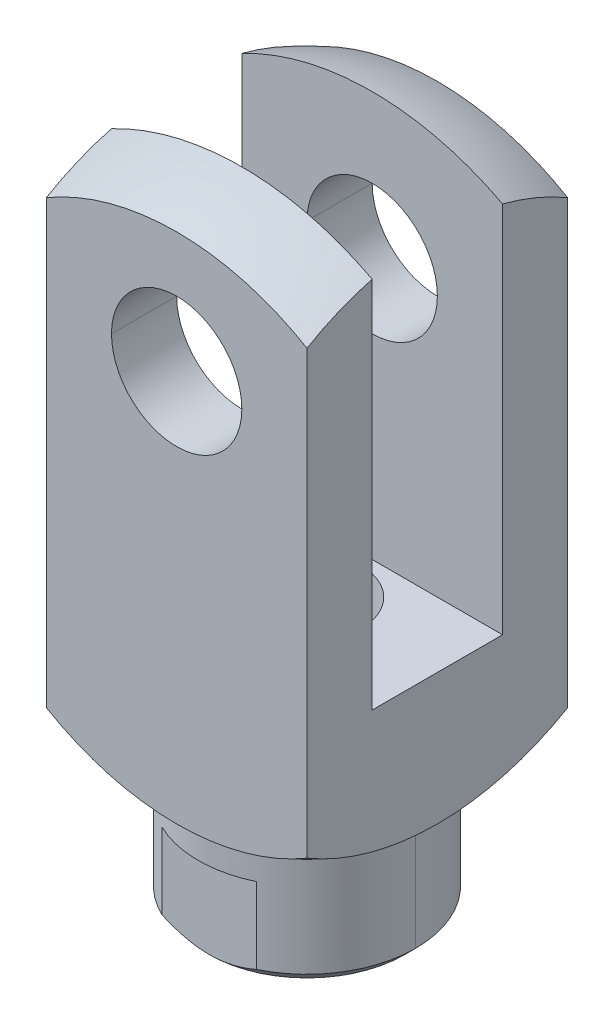
ISO-10303-21;
HEADER;
FILE_DESCRIPTION(('STEP AP214'),'2;1');
FILE_NAME('part.step','',(''),(''),'','','');
FILE_SCHEMA(('AUTOMOTIVE_DESIGN { 1 0 10303 214 1 1 1 1 }'));
ENDSEC;
DATA;
#1=APPLICATION_CONTEXT('core data for automotive mechanical design processes');
#2=APPLICATION_PROTOCOL_DEFINITION('international standard','automotive_design',2000,#1);
#3=PRODUCT_CONTEXT('',#1,'mechanical');
#4=PRODUCT('Part','Part','',(#3));
#5=PRODUCT_RELATED_PRODUCT_CATEGORY('part','',(#4));
#6=PRODUCT_DEFINITION_FORMATION('','',#4);
#7=PRODUCT_DEFINITION_CONTEXT('part definition',#1,'design');
#8=PRODUCT_DEFINITION('design','',#6,#7);
#9=PRODUCT_DEFINITION_SHAPE('','',#8);
#10=(LENGTH_UNIT() NAMED_UNIT(*) SI_UNIT(.MILLI.,.METRE.));
#11=(NAMED_UNIT(*) PLANE_ANGLE_UNIT() SI_UNIT($,.RADIAN.));
#12=(NAMED_UNIT(*) SI_UNIT($,.STERADIAN.) SOLID_ANGLE_UNIT());
#13=UNCERTAINTY_MEASURE_WITH_UNIT(LENGTH_MEASURE(1.E-05),#10,'distance_accuracy_value','');
#14=(GEOMETRIC_REPRESENTATION_CONTEXT(3) GLOBAL_UNCERTAINTY_ASSIGNED_CONTEXT((#13)) GLOBAL_UNIT_ASSIGNED_CONTEXT((#10,
#11,#12)) REPRESENTATION_CONTEXT('',''));
#15=CARTESIAN_POINT('',(0.,0.,0.));
#16=DIRECTION('',(0.,0.,1.));
#17=DIRECTION('',(1.,0.,0.));
#18=AXIS2_PLACEMENT_3D('',#15,#16,#17);
#19=CARTESIAN_POINT('',(0.,4.,0.));
#20=DIRECTION('',(0.,1.,0.));
#21=DIRECTION('',(1.,0.,0.));
#22=AXIS2_PLACEMENT_3D('',#19,#20,#21);
#23=PLANE('',#22);
#24=DIRECTION('',(-1.,0.,0.));
#25=VECTOR('',#24,1.);
#26=CARTESIAN_POINT('',(-6.,4.,-4.5));
#27=LINE('',#26,#25);
#28=CARTESIAN_POINT('',(2.17944947177034,4.,-4.5));
#29=VERTEX_POINT('',#28);
#30=CARTESIAN_POINT('',(-2.17944947177034,4.,-4.5));
#31=VERTEX_POINT('',#30);
#32=EDGE_CURVE('E9',#29,#31,#27,.T.);
#33=ORIENTED_EDGE('',*,*,#32,.T.);
#34=CARTESIAN_POINT('',(0.,4.,0.));
#35=DIRECTION('',(0.,1.,0.));
#36=DIRECTION('',(-1.,0.,0.));
#37=AXIS2_PLACEMENT_3D('',#34,#35,#36);
#38=CIRCLE('',#37,5.);
#39=EDGE_CURVE('E329',#29,#31,#38,.T.);
#40=ORIENTED_EDGE('',*,*,#39,.F.);
#41=EDGE_LOOP('',(#33,#40));
#42=FACE_BOUND('',#41,.T.);
#43=ADVANCED_FACE('F15',(#42),#23,.F.);
#44=CARTESIAN_POINT('',(-6.,4.,-4.5));
#45=DIRECTION('',(0.,0.,1.));
#46=DIRECTION('',(1.,0.,0.));
#47=AXIS2_PLACEMENT_3D('',#44,#45,#46);
#48=PLANE('',#47);
#49=ORIENTED_EDGE('',*,*,#32,.F.);
#50=DIRECTION('',(0.,1.,0.));
#51=VECTOR('',#50,1.);
#52=CARTESIAN_POINT('',(2.17944947177034,0.,-4.5));
#53=LINE('',#52,#51);
#54=CARTESIAN_POINT('',(2.17944947177034,0.5,-4.5));
#55=VERTEX_POINT('',#54);
#56=EDGE_CURVE('E333',#55,#29,#53,.T.);
#57=ORIENTED_EDGE('',*,*,#56,.F.);
#58=CARTESIAN_POINT('',(0.,0.,-4.5));
#59=CARTESIAN_POINT('',(0.0624083139395102,-9.8512919505263E-06,-4.49999565719372));
#60=CARTESIAN_POINT('',(0.124814830375076,0.00130005862040339,-4.50000198743732));
#61=CARTESIAN_POINT('',(0.249692505166691,0.00651560190394834,-4.50002507838338));
#62=CARTESIAN_POINT('',(0.312163365139314,0.010428402495713,-4.50004186787789));
#63=CARTESIAN_POINT('',(0.437383626577868,0.020846365111198,-4.5000749945896));
#64=CARTESIAN_POINT('',(0.500131338091005,0.0273717326448217,-4.50009132719445));
#65=CARTESIAN_POINT('',(0.624191383465886,0.0427646811018383,-4.50009057450432));
#66=CARTESIAN_POINT('',(0.685509231119237,0.0515880106750513,-4.50007408515045));
#67=CARTESIAN_POINT('',(0.808128841461158,0.0716255057725899,-4.50004093137011));
#68=CARTESIAN_POINT('',(0.86942831642889,0.0828536492554769,-4.50002426648633));
#69=CARTESIAN_POINT('',(0.992189213260649,0.10769420716025,-4.50000631414634));
#70=CARTESIAN_POINT('',(1.05364595576919,0.12132968089418,-4.50000518460241));
#71=CARTESIAN_POINT('',(1.17352966816377,0.150148581400513,-4.49999502808374));
#72=CARTESIAN_POINT('',(1.23197750438556,0.165245560464626,-4.49998632698344));
#73=CARTESIAN_POINT('',(1.3490013603991,0.197475262111992,-4.49996309960316));
#74=CARTESIAN_POINT('',(1.40757169864742,0.214628579622493,-4.49994851020484));
#75=CARTESIAN_POINT('',(1.52496431587403,0.250970583609624,-4.49992930236046));
#76=CARTESIAN_POINT('',(1.58377888153367,0.270184132608367,-4.49992482456507));
#77=CARTESIAN_POINT('',(1.70177925285977,0.310641579128573,-4.49992683357821));
#78=CARTESIAN_POINT('',(1.76095542638641,0.331913518063483,-4.49993350070788));
#79=CARTESIAN_POINT('',(1.87979033731317,0.376484826929173,-4.49995370809289));
#80=CARTESIAN_POINT('',(1.93943768864025,0.399814467864979,-4.49996737345363));
#81=CARTESIAN_POINT('',(2.05932155929277,0.448500730148102,-4.49999028313905));
#82=CARTESIAN_POINT('',(2.11954523458739,0.473889016447024,-4.49999943147914));
#83=CARTESIAN_POINT('',(2.17944947177035,0.5,-4.5));
#84=B_SPLINE_CURVE_WITH_KNOTS('',3,(#58,#59,#60,#61,#62,#63,#64,#65,#66,#67,#68,#69,#70,#71,#72,
#73,#74,#75,#76,#77,#78,#79,#80,#81,#82,#83),.UNSPECIFIED.,.F.,.F.,(4,2,2,2,2,2,2,2,2,2,2,2,4),
(0.,0.187208180842976,0.374933996628471,0.564140624768672,0.749943200948702,0.936856574525328,
1.12566848094859,1.30673482197672,1.48979592049012,1.67538808148698,1.86401221651606,
2.05613257081411,2.25217636638371),.UNSPECIFIED.);
#85=CARTESIAN_POINT('',(0.,0.,-4.5));
#86=VERTEX_POINT('',#85);
#87=EDGE_CURVE('E493',#86,#55,#84,.T.);
#88=ORIENTED_EDGE('',*,*,#87,.F.);
#89=CARTESIAN_POINT('',(-2.17944947177033,0.5,-4.50000000000001));
#90=CARTESIAN_POINT('',(-2.09011930336106,0.461062215793076,-4.49999538096775));
#91=CARTESIAN_POINT('',(-2.00006782645763,0.423728612484611,-4.49997809734676));
#92=CARTESIAN_POINT('',(-1.82109955420626,0.353793828030703,-4.4999457877909));
#93=CARTESIAN_POINT('',(-1.73222347899744,0.321088152972586,-4.49993071157791));
#94=CARTESIAN_POINT('',(-1.55523748765586,0.260395919782736,-4.49992716103705));
#95=CARTESIAN_POINT('',(-1.4671601002241,0.232315190456123,-4.49993805899354));
#96=CARTESIAN_POINT('',(-1.29138670953351,0.180871773585244,-4.49997920474237));
#97=CARTESIAN_POINT('',(-1.20371327576294,0.157432081609204,-4.50000909441795));
#98=CARTESIAN_POINT('',(-1.02239597340562,0.11378850291893,-4.49999040111164));
#99=CARTESIAN_POINT('',(-0.928690690280405,0.0938362303585763,-4.49993737325583));
#100=CARTESIAN_POINT('',(-0.78816008090279,0.0681394201419825,-4.49986432067149));
#101=CARTESIAN_POINT('',(-0.74170639764179,0.0603269063668864,-4.49984121696548));
#102=CARTESIAN_POINT('',(-0.648943484460722,0.0461333052019471,-4.49980936663185));
#103=CARTESIAN_POINT('',(-0.60263587561617,0.0397417071195584,-4.49980051133796));
#104=CARTESIAN_POINT('',(-0.510084082673379,0.0283867289343194,-4.49979990650352));
#105=CARTESIAN_POINT('',(-0.463840766134113,0.0234162761252116,-4.49980807051514));
#106=CARTESIAN_POINT('',(-0.371332917395538,0.0148998061742727,-4.49983872993487));
#107=CARTESIAN_POINT('',(-0.325068692753783,0.0113504554465792,-4.49986119147951));
#108=CARTESIAN_POINT('',(-0.232433672609766,0.0056732526278714,-4.4999114536509));
#109=CARTESIAN_POINT('',(-0.186062840539251,0.00354599755094677,-4.4999392565137));
#110=CARTESIAN_POINT('',(-0.0931280093398019,0.000705650163874135,-4.49998297946715));
#111=CARTESIAN_POINT('',(-0.04656386985404,-2.85502111122517E-06,-4.49999886091015));
#112=CARTESIAN_POINT('',(0.,0.,-4.5));
#113=B_SPLINE_CURVE_WITH_KNOTS('',3,(#89,#90,#91,#92,#93,#94,#95,#96,#97,#98,#99,#100,#101,#102,
#103,#104,#105,#106,#107,#108,#109,#110,#111,#112),.UNSPECIFIED.,.F.,.F.,(4,2,2,2,2,2,2,2,2,2,2,
4),(0.,0.292356366068492,0.576386848765495,0.853623051619891,1.12578070595524,1.41303503667744,
1.55433622927236,1.69455458394432,1.83406244946013,1.97324111613323,2.11247817517412,
2.25216469551639),.UNSPECIFIED.);
#114=CARTESIAN_POINT('',(-2.17944947177034,0.5,-4.5));
#115=VERTEX_POINT('',#114);
#116=EDGE_CURVE('E526',#115,#86,#113,.T.);
#117=ORIENTED_EDGE('',*,*,#116,.F.);
#118=DIRECTION('',(0.,-1.,0.));
#119=VECTOR('',#118,1.);
#120=CARTESIAN_POINT('',(-2.17944947177034,0.,-4.5));
#121=LINE('',#120,#119);
#122=EDGE_CURVE('E316',#31,#115,#121,.T.);
#123=ORIENTED_EDGE('',*,*,#122,.F.);
#124=EDGE_LOOP('',(#49,#57,#88,#117,#123));
#125=FACE_BOUND('',#124,.T.);
#126=ADVANCED_FACE('F498',(#125),#48,.F.);
#127=CARTESIAN_POINT('',(0.,4.,0.));
#128=DIRECTION('',(0.,-1.,0.));
#129=DIRECTION('',(0.,0.,-1.));
#130=AXIS2_PLACEMENT_3D('',#127,#128,#129);
#131=PLANE('',#130);
#132=CARTESIAN_POINT('',(0.,4.,0.));
#133=DIRECTION('',(0.,-1.,0.));
#134=DIRECTION('',(1.,0.,0.));
#135=AXIS2_PLACEMENT_3D('',#132,#133,#134);
#136=CIRCLE('',#135,5.);
#137=CARTESIAN_POINT('',(2.17944947177034,4.,4.5));
#138=VERTEX_POINT('',#137);
#139=CARTESIAN_POINT('',(-2.17944947177034,4.,4.5));
#140=VERTEX_POINT('',#139);
#141=EDGE_CURVE('E251',#138,#140,#136,.T.);
#142=ORIENTED_EDGE('',*,*,#141,.T.);
#143=DIRECTION('',(1.,0.,0.));
#144=VECTOR('',#143,1.);
#145=CARTESIAN_POINT('',(-6.,4.,4.5));
#146=LINE('',#145,#144);
#147=EDGE_CURVE('E24',#140,#138,#146,.T.);
#148=ORIENTED_EDGE('',*,*,#147,.T.);
#149=EDGE_LOOP('',(#142,#148));
#150=FACE_BOUND('',#149,.T.);
#151=ADVANCED_FACE('F507',(#150),#131,.T.);
#152=CARTESIAN_POINT('',(-6.,4.,4.5));
#153=DIRECTION('',(0.,0.,-1.));
#154=DIRECTION('',(0.,-1.,0.));
#155=AXIS2_PLACEMENT_3D('',#152,#153,#154);
#156=PLANE('',#155);
#157=ORIENTED_EDGE('',*,*,#147,.F.);
#158=DIRECTION('',(0.,1.,0.));
#159=VECTOR('',#158,1.);
#160=CARTESIAN_POINT('',(-2.17944947177034,0.,4.5));
#161=LINE('',#160,#159);
#162=CARTESIAN_POINT('',(-2.17944947177034,0.5,4.5));
#163=VERTEX_POINT('',#162);
#164=EDGE_CURVE('E254',#163,#140,#161,.T.);
#165=ORIENTED_EDGE('',*,*,#164,.F.);
#166=CARTESIAN_POINT('',(0.,0.,4.5));
#167=CARTESIAN_POINT('',(-0.0465602842977729,-2.85581907754603E-06,4.49999885981426));
#168=CARTESIAN_POINT('',(-0.0931208351087482,0.00070566540117156,4.49998310598267));
#169=CARTESIAN_POINT('',(-0.186049515551227,0.00354601339648532,4.49993979696131));
#170=CARTESIAN_POINT('',(-0.232417784590348,0.00567328429913484,4.49991227964752));
#171=CARTESIAN_POINT('',(-0.325048704480833,0.011350486543484,4.49986265070272));
#172=CARTESIAN_POINT('',(-0.371311389973167,0.0148998523684788,4.49984053692855));
#173=CARTESIAN_POINT('',(-0.463817186793613,0.023416323989384,4.4998105438219));
#174=CARTESIAN_POINT('',(-0.510059987698938,0.0283867943197735,4.49980269859933));
#175=CARTESIAN_POINT('',(-0.602611779548342,0.0397417656011777,4.49980380233713));
#176=CARTESIAN_POINT('',(-0.648919899292565,0.0461333689439158,4.49981283740091));
#177=CARTESIAN_POINT('',(-0.741684853877306,0.0603269940739549,4.49984487281281));
#178=CARTESIAN_POINT('',(-0.788140063288422,0.0681395548463222,4.49986798076632));
#179=CARTESIAN_POINT('',(-0.928678311185108,0.0938364842229502,4.49994031149446));
#180=CARTESIAN_POINT('',(-1.02238980447604,0.113788426839518,4.4999918529719));
#181=CARTESIAN_POINT('',(-1.20370727369095,0.157429302313509,4.50000771782376));
#182=CARTESIAN_POINT('',(-1.29137481304227,0.180865986700356,4.49997649300057));
#183=CARTESIAN_POINT('',(-1.46714014431357,0.232305472196585,4.49993431731623));
#184=CARTESIAN_POINT('',(-1.55521530502188,0.260385490625245,4.49992375665126));
#185=CARTESIAN_POINT('',(-1.73220100824497,0.321077828325899,4.49992833267188));
#186=CARTESIAN_POINT('',(-1.82107895508597,0.353784510823311,4.49994410675146));
#187=CARTESIAN_POINT('',(-2.00005537396646,0.423723003097988,4.49997759596698));
#188=CARTESIAN_POINT('',(-2.09011305671996,0.461059483822333,4.49999535449753));
#189=CARTESIAN_POINT('',(-2.17944947177034,0.5,4.5));
#190=B_SPLINE_CURVE_WITH_KNOTS('',3,(#166,#167,#168,#169,#170,#171,#172,#173,#174,#175,#176,
#177,#178,#179,#180,#181,#182,#183,#184,#185,#186,#187,#188,#189),.UNSPECIFIED.,.F.,.F.,(4,2,2,
2,2,2,2,2,2,2,2,4),(0.,0.139675758443835,0.278905137548006,0.418079204932338,0.557585541683114,
0.697805419434693,0.839111160573759,1.12638353934038,1.39852174282943,1.6757508862044,
1.95978768746728,2.25216453819259),.UNSPECIFIED.);
#191=CARTESIAN_POINT('',(0.,0.,4.5));
#192=VERTEX_POINT('',#191);
#193=EDGE_CURVE('E384',#192,#163,#190,.T.);
#194=ORIENTED_EDGE('',*,*,#193,.F.);
#195=CARTESIAN_POINT('',(2.17944947177034,0.500000000000001,4.5));
#196=CARTESIAN_POINT('',(2.11954985778027,0.473891026908528,4.49999943029124));
#197=CARTESIAN_POINT('',(2.05933078498911,0.448504810250606,4.49999049792651));
#198=CARTESIAN_POINT('',(1.9394541933267,0.399821818231493,4.49996823414724));
#199=CARTESIAN_POINT('',(1.87980949828346,0.376493427575447,4.49995499420233));
#200=CARTESIAN_POINT('',(1.76097804459363,0.331923762041575,4.49993564144361));
#201=CARTESIAN_POINT('',(1.70180265165933,0.310652269893045,4.49992940352126));
#202=CARTESIAN_POINT('',(1.58380207284819,0.270194815507064,4.49992799919439));
#203=CARTESIAN_POINT('',(1.52498649921665,0.250980869759454,4.49993265677374));
#204=CARTESIAN_POINT('',(1.40759014422243,0.214637308143077,4.499951915624));
#205=CARTESIAN_POINT('',(1.34901705812603,0.197482887862697,4.49996638072612));
#206=CARTESIAN_POINT('',(1.23198619656814,0.16524970249476,4.49998829334488));
#207=CARTESIAN_POINT('',(1.173534085269,0.150150406691396,4.49999581541483));
#208=CARTESIAN_POINT('',(1.05366038510673,0.121332353696962,4.50000436223406));
#209=CARTESIAN_POINT('',(0.992218079085911,0.107699417772905,4.50000509759467));
#210=CARTESIAN_POINT('',(0.869471534830104,0.0828613641917713,4.50002377068064));
#211=CARTESIAN_POINT('',(0.80817186899874,0.0716337135486619,4.5000415393563));
#212=CARTESIAN_POINT('',(0.685537873646518,0.0515933239285748,4.50007528807043));
#213=CARTESIAN_POINT('',(0.624205741327676,0.0427671598445717,4.50009127774409));
#214=CARTESIAN_POINT('',(0.500138584913575,0.0273719220113399,4.50009061118825));
#215=CARTESIAN_POINT('',(0.437398152370954,0.020846245765221,4.50007336331059));
#216=CARTESIAN_POINT('',(0.312185171383144,0.0104279272916565,4.50003987624569));
#217=CARTESIAN_POINT('',(0.249714289138406,0.00651536490836451,4.50002363030455));
#218=CARTESIAN_POINT('',(0.124829322745926,0.00129999234447434,4.50000162241519));
#219=CARTESIAN_POINT('',(0.0624155244589685,-9.68420592762984E-06,4.49999583288682));
#220=CARTESIAN_POINT('',(0.,0.,4.5));
#221=B_SPLINE_CURVE_WITH_KNOTS('',3,(#195,#196,#197,#198,#199,#200,#201,#202,#203,#204,#205,
#206,#207,#208,#209,#210,#211,#212,#213,#214,#215,#216,#217,#218,#219,#220),.UNSPECIFIED.,.F.,
.F.,(4,2,2,2,2,2,2,2,2,2,2,2,4),(0.,0.196028663569003,0.388140228460129,0.576761712188381,
0.762357119312249,0.945427081516891,1.12650758316975,1.31527552573205,1.50218920190429,
1.6880354351466,1.87722041822238,2.06494623400787,2.25217617137292),.UNSPECIFIED.);
#222=CARTESIAN_POINT('',(2.17944947177034,0.5,4.5));
#223=VERTEX_POINT('',#222);
#224=EDGE_CURVE('E453',#223,#192,#221,.T.);
#225=ORIENTED_EDGE('',*,*,#224,.F.);
#226=DIRECTION('',(0.,-1.,0.));
#227=VECTOR('',#226,1.);
#228=CARTESIAN_POINT('',(2.17944947177034,0.,4.5));
#229=LINE('',#228,#227);
#230=EDGE_CURVE('E253',#138,#223,#229,.T.);
#231=ORIENTED_EDGE('',*,*,#230,.F.);
#232=EDGE_LOOP('',(#157,#165,#194,#225,#231));
#233=FACE_BOUND('',#232,.T.);
#234=ADVANCED_FACE('F556',(#233),#156,.F.);
#235=CARTESIAN_POINT('',(0.,24.,-25.));
#236=DIRECTION('',(0.,0.,1.));
#237=DIRECTION('',(1.,0.,0.));
#238=AXIS2_PLACEMENT_3D('',#235,#236,#237);
#239=CYLINDRICAL_SURFACE('',#238,3.);
#240=DIRECTION('',(0.,0.,1.));
#241=VECTOR('',#240,1.);
#242=CARTESIAN_POINT('',(-3.,24.,-25.));
#243=LINE('',#242,#241);
#244=CARTESIAN_POINT('',(-3.,24.,-6.));
#245=VERTEX_POINT('',#244);
#246=CARTESIAN_POINT('',(-3.,24.,-3.));
#247=VERTEX_POINT('',#246);
#248=EDGE_CURVE('E236',#245,#247,#243,.T.);
#249=ORIENTED_EDGE('',*,*,#248,.F.);
#250=CARTESIAN_POINT('',(0.,24.,-6.));
#251=DIRECTION('',(0.,0.,1.));
#252=DIRECTION('',(1.,0.,0.));
#253=AXIS2_PLACEMENT_3D('',#250,#251,#252);
#254=CIRCLE('',#253,3.);
#255=CARTESIAN_POINT('',(3.,24.,-6.));
#256=VERTEX_POINT('',#255);
#257=EDGE_CURVE('E222',#256,#245,#254,.T.);
#258=ORIENTED_EDGE('',*,*,#257,.F.);
#259=DIRECTION('',(0.,0.,1.));
#260=VECTOR('',#259,1.);
#261=CARTESIAN_POINT('',(3.,24.,-25.));
#262=LINE('',#261,#260);
#263=CARTESIAN_POINT('',(3.,24.,-3.));
#264=VERTEX_POINT('',#263);
#265=EDGE_CURVE('E246',#256,#264,#262,.T.);
#266=ORIENTED_EDGE('',*,*,#265,.T.);
#267=CARTESIAN_POINT('',(0.,24.,-3.));
#268=DIRECTION('',(0.,0.,-1.));
#269=DIRECTION('',(0.,1.,0.));
#270=AXIS2_PLACEMENT_3D('',#267,#268,#269);
#271=CIRCLE('',#270,3.);
#272=EDGE_CURVE('E238',#247,#264,#271,.T.);
#273=ORIENTED_EDGE('',*,*,#272,.F.);
#274=EDGE_LOOP('',(#249,#258,#266,#273));
#275=FACE_BOUND('',#274,.T.);
#276=ADVANCED_FACE('F237',(#275),#239,.F.);
#277=CARTESIAN_POINT('',(0.,24.,-25.));
#278=DIRECTION('',(0.,0.,1.));
#279=DIRECTION('',(1.,0.,0.));
#280=AXIS2_PLACEMENT_3D('',#277,#278,#279);
#281=CYLINDRICAL_SURFACE('',#280,3.);
#282=DIRECTION('',(0.,0.,1.));
#283=VECTOR('',#282,1.);
#284=CARTESIAN_POINT('',(-3.,24.,-25.));
#285=LINE('',#284,#283);
#286=CARTESIAN_POINT('',(-3.,24.,3.));
#287=VERTEX_POINT('',#286);
#288=CARTESIAN_POINT('',(-3.,24.,6.));
#289=VERTEX_POINT('',#288);
#290=EDGE_CURVE('E278',#287,#289,#285,.T.);
#291=ORIENTED_EDGE('',*,*,#290,.F.);
#292=CARTESIAN_POINT('',(0.,24.,3.));
#293=DIRECTION('',(0.,0.,1.));
#294=DIRECTION('',(0.,-1.,0.));
#295=AXIS2_PLACEMENT_3D('',#292,#293,#294);
#296=CIRCLE('',#295,3.);
#297=CARTESIAN_POINT('',(3.,24.,3.));
#298=VERTEX_POINT('',#297);
#299=EDGE_CURVE('E258',#298,#287,#296,.T.);
#300=ORIENTED_EDGE('',*,*,#299,.F.);
#301=DIRECTION('',(0.,0.,1.));
#302=VECTOR('',#301,1.);
#303=CARTESIAN_POINT('',(3.,24.,-25.));
#304=LINE('',#303,#302);
#305=CARTESIAN_POINT('',(3.,24.,6.));
#306=VERTEX_POINT('',#305);
#307=EDGE_CURVE('E286',#298,#306,#304,.T.);
#308=ORIENTED_EDGE('',*,*,#307,.T.);
#309=CARTESIAN_POINT('',(0.,24.,6.));
#310=DIRECTION('',(0.,0.,-1.));
#311=DIRECTION('',(-1.,0.,0.));
#312=AXIS2_PLACEMENT_3D('',#309,#310,#311);
#313=CIRCLE('',#312,3.);
#314=EDGE_CURVE('E385',#289,#306,#313,.T.);
#315=ORIENTED_EDGE('',*,*,#314,.F.);
#316=EDGE_LOOP('',(#291,#300,#308,#315));
#317=FACE_BOUND('',#316,.T.);
#318=ADVANCED_FACE('F702',(#317),#281,.F.);
#319=CARTESIAN_POINT('',(-25.,12.,3.));
#320=DIRECTION('',(0.,0.,1.));
#321=DIRECTION('',(0.,-1.,0.));
#322=AXIS2_PLACEMENT_3D('',#319,#320,#321);
#323=PLANE('',#322);
#324=ORIENTED_EDGE('',*,*,#299,.T.);
#325=CARTESIAN_POINT('',(0.,24.,3.));
#326=DIRECTION('',(0.,0.,1.));
#327=DIRECTION('',(0.,-1.,0.));
#328=AXIS2_PLACEMENT_3D('',#325,#326,#327);
#329=CIRCLE('',#328,3.);
#330=EDGE_CURVE('E270',#287,#298,#329,.T.);
#331=ORIENTED_EDGE('',*,*,#330,.T.);
#332=EDGE_LOOP('',(#324,#331));
#333=FACE_BOUND('',#332,.T.);
#334=DIRECTION('',(1.,0.,0.));
#335=VECTOR('',#334,1.);
#336=CARTESIAN_POINT('',(-25.,12.,3.));
#337=LINE('',#336,#335);
#338=CARTESIAN_POINT('',(-6.,12.,3.));
#339=VERTEX_POINT('',#338);
#340=CARTESIAN_POINT('',(6.,12.,3.));
#341=VERTEX_POINT('',#340);
#342=EDGE_CURVE('E259',#339,#341,#337,.T.);
#343=ORIENTED_EDGE('',*,*,#342,.F.);
#344=DIRECTION('',(0.,-1.,0.));
#345=VECTOR('',#344,1.);
#346=CARTESIAN_POINT('',(-6.,31.,3.));
#347=LINE('',#346,#345);
#348=CARTESIAN_POINT('',(-6.,29.174828765839,3.));
#349=VERTEX_POINT('',#348);
#350=EDGE_CURVE('E377',#349,#339,#347,.T.);
#351=ORIENTED_EDGE('',*,*,#350,.F.);
#352=CARTESIAN_POINT('',(0.,17.7598039215687,3.));
#353=DIRECTION('',(0.,0.,1.));
#354=DIRECTION('',(0.,-1.,0.));
#355=AXIS2_PLACEMENT_3D('',#352,#353,#354);
#356=CIRCLE('',#355,12.8958439892591);
#357=CARTESIAN_POINT('',(6.,29.174828765839,3.));
#358=VERTEX_POINT('',#357);
#359=EDGE_CURVE('E35',#358,#349,#356,.T.);
#360=ORIENTED_EDGE('',*,*,#359,.F.);
#361=DIRECTION('',(0.,1.,0.));
#362=VECTOR('',#361,1.);
#363=CARTESIAN_POINT('',(6.,31.,3.));
#364=LINE('',#363,#362);
#365=EDGE_CURVE('E419',#341,#358,#364,.T.);
#366=ORIENTED_EDGE('',*,*,#365,.F.);
#367=EDGE_LOOP('',(#343,#351,#360,#366));
#368=FACE_BOUND('',#367,.T.);
#369=ADVANCED_FACE('F708',(#333,#368),#323,.F.);
#370=CARTESIAN_POINT('',(-25.,12.,-3.));
#371=DIRECTION('',(0.,0.,-1.));
#372=DIRECTION('',(0.,-1.,0.));
#373=AXIS2_PLACEMENT_3D('',#370,#371,#372);
#374=PLANE('',#373);
#375=CARTESIAN_POINT('',(0.,24.,-3.));
#376=DIRECTION('',(0.,0.,-1.));
#377=DIRECTION('',(0.,1.,0.));
#378=AXIS2_PLACEMENT_3D('',#375,#376,#377);
#379=CIRCLE('',#378,3.);
#380=EDGE_CURVE('E243',#264,#247,#379,.T.);
#381=ORIENTED_EDGE('',*,*,#380,.T.);
#382=ORIENTED_EDGE('',*,*,#272,.T.);
#383=EDGE_LOOP('',(#381,#382));
#384=FACE_BOUND('',#383,.T.);
#385=CARTESIAN_POINT('',(0.,17.7598039215687,-3.));
#386=DIRECTION('',(0.,0.,-1.));
#387=DIRECTION('',(0.,1.,0.));
#388=AXIS2_PLACEMENT_3D('',#385,#386,#387);
#389=CIRCLE('',#388,12.8958439892591);
#390=CARTESIAN_POINT('',(-6.,29.174828765839,-3.));
#391=VERTEX_POINT('',#390);
#392=CARTESIAN_POINT('',(6.,29.174828765839,-3.));
#393=VERTEX_POINT('',#392);
#394=EDGE_CURVE('E383',#391,#393,#389,.T.);
#395=ORIENTED_EDGE('',*,*,#394,.F.);
#396=DIRECTION('',(0.,1.,0.));
#397=VECTOR('',#396,1.);
#398=CARTESIAN_POINT('',(-6.,31.,-3.));
#399=LINE('',#398,#397);
#400=CARTESIAN_POINT('',(-6.,12.,-3.));
#401=VERTEX_POINT('',#400);
#402=EDGE_CURVE('E274',#401,#391,#399,.T.);
#403=ORIENTED_EDGE('',*,*,#402,.F.);
#404=DIRECTION('',(1.,0.,0.));
#405=VECTOR('',#404,1.);
#406=CARTESIAN_POINT('',(-25.,12.,-3.));
#407=LINE('',#406,#405);
#408=CARTESIAN_POINT('',(6.,12.,-3.));
#409=VERTEX_POINT('',#408);
#410=EDGE_CURVE('E401',#401,#409,#407,.T.);
#411=ORIENTED_EDGE('',*,*,#410,.T.);
#412=DIRECTION('',(0.,-1.,0.));
#413=VECTOR('',#412,1.);
#414=CARTESIAN_POINT('',(6.,31.,-3.));
#415=LINE('',#414,#413);
#416=EDGE_CURVE('E311',#393,#409,#415,.T.);
#417=ORIENTED_EDGE('',*,*,#416,.F.);
#418=EDGE_LOOP('',(#395,#403,#411,#417));
#419=FACE_BOUND('',#418,.T.);
#420=ADVANCED_FACE('F715',(#384,#419),#374,.F.);
#421=CARTESIAN_POINT('',(-25.,12.,3.));
#422=DIRECTION('',(0.,-1.,0.));
#423=DIRECTION('',(0.,0.,-1.));
#424=AXIS2_PLACEMENT_3D('',#421,#422,#423);
#425=PLANE('',#424);
#426=CARTESIAN_POINT('',(0.,12.,0.));
#427=DIRECTION('',(0.,1.,0.));
#428=DIRECTION('',(0.,0.,-1.));
#429=AXIS2_PLACEMENT_3D('',#426,#427,#428);
#430=CIRCLE('',#429,2.5);
#431=CARTESIAN_POINT('',(2.5,12.,0.));
#432=VERTEX_POINT('',#431);
#433=CARTESIAN_POINT('',(-2.5,12.,0.));
#434=VERTEX_POINT('',#433);
#435=EDGE_CURVE('E320',#432,#434,#430,.T.);
#436=ORIENTED_EDGE('',*,*,#435,.F.);
#437=CARTESIAN_POINT('',(0.,12.,0.));
#438=DIRECTION('',(0.,1.,0.));
#439=DIRECTION('',(0.,0.,-1.));
#440=AXIS2_PLACEMENT_3D('',#437,#438,#439);
#441=CIRCLE('',#440,2.5);
#442=EDGE_CURVE('E364',#434,#432,#441,.T.);
#443=ORIENTED_EDGE('',*,*,#442,.F.);
#444=EDGE_LOOP('',(#436,#443));
#445=FACE_BOUND('',#444,.T.);
#446=ORIENTED_EDGE('',*,*,#410,.F.);
#447=DIRECTION('',(0.,0.,-1.));
#448=VECTOR('',#447,1.);
#449=CARTESIAN_POINT('',(-6.,12.,-6.));
#450=LINE('',#449,#448);
#451=EDGE_CURVE('E232',#339,#401,#450,.T.);
#452=ORIENTED_EDGE('',*,*,#451,.F.);
#453=ORIENTED_EDGE('',*,*,#342,.T.);
#454=DIRECTION('',(0.,0.,1.));
#455=VECTOR('',#454,1.);
#456=CARTESIAN_POINT('',(6.,12.,-6.));
#457=LINE('',#456,#455);
#458=EDGE_CURVE('E315',#409,#341,#457,.T.);
#459=ORIENTED_EDGE('',*,*,#458,.F.);
#460=EDGE_LOOP('',(#446,#452,#453,#459));
#461=FACE_BOUND('',#460,.T.);
#462=ADVANCED_FACE('F723',(#445,#461),#425,.F.);
#463=CARTESIAN_POINT('',(0.,17.7598039215687,0.));
#464=DIRECTION('',(0.,0.,-1.));
#465=DIRECTION('',(-1.,0.,0.));
#466=AXIS2_PLACEMENT_3D('',#463,#464,#465);
#467=SPHERICAL_SURFACE('',#466,13.2401960784314);
#468=CARTESIAN_POINT('',(6.,17.7598039215687,0.));
#469=DIRECTION('',(-1.,0.,0.));
#470=DIRECTION('',(0.,0.,1.));
#471=AXIS2_PLACEMENT_3D('',#468,#469,#470);
#472=CIRCLE('',#471,11.8026603863413);
#473=CARTESIAN_POINT('',(6.,27.9236020401515,6.));
#474=VERTEX_POINT('',#473);
#475=EDGE_CURVE('E423',#474,#358,#472,.T.);
#476=ORIENTED_EDGE('',*,*,#475,.T.);
#477=ORIENTED_EDGE('',*,*,#359,.T.);
#478=CARTESIAN_POINT('',(-6.,17.7598039215687,0.));
#479=DIRECTION('',(1.,0.,0.));
#480=DIRECTION('',(0.,0.,-1.));
#481=AXIS2_PLACEMENT_3D('',#478,#479,#480);
#482=CIRCLE('',#481,11.8026603863413);
#483=CARTESIAN_POINT('',(-6.,27.9236020401515,6.));
#484=VERTEX_POINT('',#483);
#485=EDGE_CURVE('E374',#349,#484,#482,.T.);
#486=ORIENTED_EDGE('',*,*,#485,.T.);
#487=CARTESIAN_POINT('',(0.,17.7598039215687,6.));
#488=DIRECTION('',(0.,0.,-1.));
#489=DIRECTION('',(-1.,0.,0.));
#490=AXIS2_PLACEMENT_3D('',#487,#488,#489);
#491=CIRCLE('',#490,11.8026603863413);
#492=EDGE_CURVE('E44',#484,#474,#491,.T.);
#493=ORIENTED_EDGE('',*,*,#492,.T.);
#494=EDGE_LOOP('',(#476,#477,#486,#493));
#495=FACE_BOUND('',#494,.T.);
#496=ADVANCED_FACE('F731',(#495),#467,.T.);
#497=CARTESIAN_POINT('',(-6.,31.,6.));
#498=DIRECTION('',(0.,0.,-1.));
#499=DIRECTION('',(0.,-1.,0.));
#500=AXIS2_PLACEMENT_3D('',#497,#498,#499);
#501=PLANE('',#500);
#502=CARTESIAN_POINT('',(0.,24.,6.));
#503=DIRECTION('',(0.,0.,-1.));
#504=DIRECTION('',(-1.,0.,0.));
#505=AXIS2_PLACEMENT_3D('',#502,#503,#504);
#506=CIRCLE('',#505,3.);
#507=EDGE_CURVE('E282',#306,#289,#506,.T.);
#508=ORIENTED_EDGE('',*,*,#507,.T.);
#509=ORIENTED_EDGE('',*,*,#314,.T.);
#510=EDGE_LOOP('',(#508,#509));
#511=FACE_BOUND('',#510,.T.);
#512=DIRECTION('',(0.,-1.,0.));
#513=VECTOR('',#512,1.);
#514=CARTESIAN_POINT('',(-6.,31.,6.));
#515=LINE('',#514,#513);
#516=CARTESIAN_POINT('',(-6.,7.59600580298571,6.));
#517=VERTEX_POINT('',#516);
#518=EDGE_CURVE('E378',#484,#517,#515,.T.);
#519=ORIENTED_EDGE('',*,*,#518,.T.);
#520=CARTESIAN_POINT('',(0.,17.7598039215687,6.));
#521=DIRECTION('',(0.,0.,-1.));
#522=DIRECTION('',(-1.,0.,0.));
#523=AXIS2_PLACEMENT_3D('',#520,#521,#522);
#524=CIRCLE('',#523,11.8026603863413);
#525=CARTESIAN_POINT('',(6.,7.59600580298571,6.));
#526=VERTEX_POINT('',#525);
#527=EDGE_CURVE('E352',#526,#517,#524,.T.);
#528=ORIENTED_EDGE('',*,*,#527,.F.);
#529=DIRECTION('',(0.,-1.,0.));
#530=VECTOR('',#529,1.);
#531=CARTESIAN_POINT('',(6.,31.,6.));
#532=LINE('',#531,#530);
#533=EDGE_CURVE('E426',#474,#526,#532,.T.);
#534=ORIENTED_EDGE('',*,*,#533,.F.);
#535=ORIENTED_EDGE('',*,*,#492,.F.);
#536=EDGE_LOOP('',(#519,#528,#534,#535));
#537=FACE_BOUND('',#536,.T.);
#538=ADVANCED_FACE('F739',(#511,#537),#501,.F.);
#539=CARTESIAN_POINT('',(-6.,31.,-6.));
#540=DIRECTION('',(1.,0.,0.));
#541=DIRECTION('',(0.,0.,-1.));
#542=AXIS2_PLACEMENT_3D('',#539,#540,#541);
#543=PLANE('',#542);
#544=ORIENTED_EDGE('',*,*,#451,.T.);
#545=ORIENTED_EDGE('',*,*,#402,.T.);
#546=CARTESIAN_POINT('',(-6.,17.7598039215687,0.));
#547=DIRECTION('',(1.,0.,0.));
#548=DIRECTION('',(0.,0.,-1.));
#549=AXIS2_PLACEMENT_3D('',#546,#547,#548);
#550=CIRCLE('',#549,11.8026603863413);
#551=CARTESIAN_POINT('',(-6.,27.9236020401515,-6.));
#552=VERTEX_POINT('',#551);
#553=EDGE_CURVE('E379',#552,#391,#550,.T.);
#554=ORIENTED_EDGE('',*,*,#553,.F.);
#555=DIRECTION('',(0.,-1.,0.));
#556=VECTOR('',#555,1.);
#557=CARTESIAN_POINT('',(-6.,31.,-6.));
#558=LINE('',#557,#556);
#559=CARTESIAN_POINT('',(-6.,7.59600580298572,-6.));
#560=VERTEX_POINT('',#559);
#561=EDGE_CURVE('E233',#552,#560,#558,.T.);
#562=ORIENTED_EDGE('',*,*,#561,.T.);
#563=CARTESIAN_POINT('',(-6.,17.7598039215687,0.));
#564=DIRECTION('',(1.,0.,0.));
#565=DIRECTION('',(0.,0.,-1.));
#566=AXIS2_PLACEMENT_3D('',#563,#564,#565);
#567=CIRCLE('',#566,11.8026603863413);
#568=CARTESIAN_POINT('',(-6.,5.95714353522735,0.));
#569=VERTEX_POINT('',#568);
#570=EDGE_CURVE('E351',#569,#560,#567,.T.);
#571=ORIENTED_EDGE('',*,*,#570,.F.);
#572=CARTESIAN_POINT('',(-6.,17.7598039215687,0.));
#573=DIRECTION('',(1.,0.,0.));
#574=DIRECTION('',(0.,0.,-1.));
#575=AXIS2_PLACEMENT_3D('',#572,#573,#574);
#576=CIRCLE('',#575,11.8026603863413);
#577=EDGE_CURVE('E356',#517,#569,#576,.T.);
#578=ORIENTED_EDGE('',*,*,#577,.F.);
#579=ORIENTED_EDGE('',*,*,#518,.F.);
#580=ORIENTED_EDGE('',*,*,#485,.F.);
#581=ORIENTED_EDGE('',*,*,#350,.T.);
#582=EDGE_LOOP('',(#544,#545,#554,#562,#571,#578,#579,#580,#581));
#583=FACE_BOUND('',#582,.T.);
#584=ADVANCED_FACE('F746',(#583),#543,.F.);
#585=CARTESIAN_POINT('',(-6.,31.,-6.));
#586=DIRECTION('',(0.,0.,1.));
#587=DIRECTION('',(1.,0.,0.));
#588=AXIS2_PLACEMENT_3D('',#585,#586,#587);
#589=PLANE('',#588);
#590=ORIENTED_EDGE('',*,*,#257,.T.);
#591=CARTESIAN_POINT('',(0.,24.,-6.));
#592=DIRECTION('',(0.,0.,1.));
#593=DIRECTION('',(1.,0.,0.));
#594=AXIS2_PLACEMENT_3D('',#591,#592,#593);
#595=CIRCLE('',#594,3.);
#596=EDGE_CURVE('E227',#245,#256,#595,.T.);
#597=ORIENTED_EDGE('',*,*,#596,.T.);
#598=EDGE_LOOP('',(#590,#597));
#599=FACE_BOUND('',#598,.T.);
#600=DIRECTION('',(0.,-1.,0.));
#601=VECTOR('',#600,1.);
#602=CARTESIAN_POINT('',(6.,31.,-6.));
#603=LINE('',#602,#601);
#604=CARTESIAN_POINT('',(6.,27.9236020401515,-6.));
#605=VERTEX_POINT('',#604);
#606=CARTESIAN_POINT('',(6.,7.59600580298571,-6.));
#607=VERTEX_POINT('',#606);
#608=EDGE_CURVE('E429',#605,#607,#603,.T.);
#609=ORIENTED_EDGE('',*,*,#608,.T.);
#610=CARTESIAN_POINT('',(0.,17.7598039215687,-6.));
#611=DIRECTION('',(0.,0.,1.));
#612=DIRECTION('',(1.,0.,0.));
#613=AXIS2_PLACEMENT_3D('',#610,#611,#612);
#614=CIRCLE('',#613,11.8026603863413);
#615=EDGE_CURVE('E361',#560,#607,#614,.T.);
#616=ORIENTED_EDGE('',*,*,#615,.F.);
#617=ORIENTED_EDGE('',*,*,#561,.F.);
#618=CARTESIAN_POINT('',(0.,17.7598039215687,-6.));
#619=DIRECTION('',(0.,0.,1.));
#620=DIRECTION('',(1.,0.,0.));
#621=AXIS2_PLACEMENT_3D('',#618,#619,#620);
#622=CIRCLE('',#621,11.8026603863413);
#623=EDGE_CURVE('E395',#605,#552,#622,.T.);
#624=ORIENTED_EDGE('',*,*,#623,.F.);
#625=EDGE_LOOP('',(#609,#616,#617,#624));
#626=FACE_BOUND('',#625,.T.);
#627=ADVANCED_FACE('F224',(#599,#626),#589,.F.);
#628=CARTESIAN_POINT('',(6.,31.,-6.));
#629=DIRECTION('',(-1.,0.,0.));
#630=DIRECTION('',(0.,1.,0.));
#631=AXIS2_PLACEMENT_3D('',#628,#629,#630);
#632=PLANE('',#631);
#633=CARTESIAN_POINT('',(6.,17.7598039215687,0.));
#634=DIRECTION('',(-1.,0.,0.));
#635=DIRECTION('',(0.,0.,1.));
#636=AXIS2_PLACEMENT_3D('',#633,#634,#635);
#637=CIRCLE('',#636,11.8026603863413);
#638=EDGE_CURVE('E391',#393,#605,#637,.T.);
#639=ORIENTED_EDGE('',*,*,#638,.F.);
#640=ORIENTED_EDGE('',*,*,#416,.T.);
#641=ORIENTED_EDGE('',*,*,#458,.T.);
#642=ORIENTED_EDGE('',*,*,#365,.T.);
#643=ORIENTED_EDGE('',*,*,#475,.F.);
#644=ORIENTED_EDGE('',*,*,#533,.T.);
#645=CARTESIAN_POINT('',(6.,17.7598039215687,0.));
#646=DIRECTION('',(-1.,0.,0.));
#647=DIRECTION('',(0.,0.,1.));
#648=AXIS2_PLACEMENT_3D('',#645,#646,#647);
#649=CIRCLE('',#648,11.8026603863413);
#650=CARTESIAN_POINT('',(6.,5.95714353522735,0.));
#651=VERTEX_POINT('',#650);
#652=EDGE_CURVE('E357',#651,#526,#649,.T.);
#653=ORIENTED_EDGE('',*,*,#652,.F.);
#654=CARTESIAN_POINT('',(6.,17.7598039215687,0.));
#655=DIRECTION('',(-1.,0.,0.));
#656=DIRECTION('',(0.,0.,1.));
#657=AXIS2_PLACEMENT_3D('',#654,#655,#656);
#658=CIRCLE('',#657,11.8026603863413);
#659=EDGE_CURVE('E337',#607,#651,#658,.T.);
#660=ORIENTED_EDGE('',*,*,#659,.F.);
#661=ORIENTED_EDGE('',*,*,#608,.F.);
#662=EDGE_LOOP('',(#639,#640,#641,#642,#643,#644,#653,#660,#661));
#663=FACE_BOUND('',#662,.T.);
#664=ADVANCED_FACE('F619',(#663),#632,.F.);
#665=CARTESIAN_POINT('',(0.,0.,0.));
#666=DIRECTION('',(0.,-1.,0.));
#667=DIRECTION('',(1.,0.,0.));
#668=AXIS2_PLACEMENT_3D('',#665,#666,#667);
#669=CYLINDRICAL_SURFACE('',#668,5.);
#670=DIRECTION('',(0.,-1.,0.));
#671=VECTOR('',#670,1.);
#672=CARTESIAN_POINT('',(-5.,0.,0.));
#673=LINE('',#672,#671);
#674=CARTESIAN_POINT('',(-5.,5.5,0.));
#675=VERTEX_POINT('',#674);
#676=CARTESIAN_POINT('',(-5.,0.5,0.));
#677=VERTEX_POINT('',#676);
#678=EDGE_CURVE('E260',#675,#677,#673,.T.);
#679=ORIENTED_EDGE('',*,*,#678,.F.);
#680=CARTESIAN_POINT('',(0.,5.5,0.));
#681=DIRECTION('',(0.,-1.,0.));
#682=DIRECTION('',(1.,0.,0.));
#683=AXIS2_PLACEMENT_3D('',#680,#681,#682);
#684=CIRCLE('',#683,5.);
#685=CARTESIAN_POINT('',(5.,5.5,0.));
#686=VERTEX_POINT('',#685);
#687=EDGE_CURVE('E345',#675,#686,#684,.T.);
#688=ORIENTED_EDGE('',*,*,#687,.T.);
#689=DIRECTION('',(0.,-1.,0.));
#690=VECTOR('',#689,1.);
#691=CARTESIAN_POINT('',(5.,0.,0.));
#692=LINE('',#691,#690);
#693=CARTESIAN_POINT('',(5.,0.5,0.));
#694=VERTEX_POINT('',#693);
#695=EDGE_CURVE('E293',#686,#694,#692,.T.);
#696=ORIENTED_EDGE('',*,*,#695,.T.);
#697=CARTESIAN_POINT('',(0.,0.5,0.));
#698=DIRECTION('',(0.,-1.,0.));
#699=DIRECTION('',(1.,0.,0.));
#700=AXIS2_PLACEMENT_3D('',#697,#698,#699);
#701=CIRCLE('',#700,5.);
#702=EDGE_CURVE('E653',#55,#694,#701,.T.);
#703=ORIENTED_EDGE('',*,*,#702,.F.);
#704=ORIENTED_EDGE('',*,*,#56,.T.);
#705=ORIENTED_EDGE('',*,*,#39,.T.);
#706=ORIENTED_EDGE('',*,*,#122,.T.);
#707=CARTESIAN_POINT('',(0.,0.5,0.));
#708=DIRECTION('',(0.,-1.,0.));
#709=DIRECTION('',(1.,0.,0.));
#710=AXIS2_PLACEMENT_3D('',#707,#708,#709);
#711=CIRCLE('',#710,5.);
#712=EDGE_CURVE('E373',#677,#115,#711,.T.);
#713=ORIENTED_EDGE('',*,*,#712,.F.);
#714=EDGE_LOOP('',(#679,#688,#696,#703,#704,#705,#706,#713));
#715=FACE_BOUND('',#714,.T.);
#716=ADVANCED_FACE('F471',(#715),#669,.T.);
#717=CARTESIAN_POINT('',(0.,0.5,0.));
#718=DIRECTION('',(0.,1.,0.));
#719=DIRECTION('',(-1.,0.,0.));
#720=AXIS2_PLACEMENT_3D('',#717,#718,#719);
#721=CONICAL_SURFACE('',#720,5.,0.78539816339745);
#722=CARTESIAN_POINT('',(0.,0.,0.));
#723=DIRECTION('',(0.,-1.,0.));
#724=DIRECTION('',(1.,0.,0.));
#725=AXIS2_PLACEMENT_3D('',#722,#723,#724);
#726=CIRCLE('',#725,4.5);
#727=EDGE_CURVE('E415',#86,#192,#726,.T.);
#728=ORIENTED_EDGE('',*,*,#727,.F.);
#729=ORIENTED_EDGE('',*,*,#87,.T.);
#730=ORIENTED_EDGE('',*,*,#702,.T.);
#731=CARTESIAN_POINT('',(0.,0.5,0.));
#732=DIRECTION('',(0.,-1.,0.));
#733=DIRECTION('',(1.,0.,0.));
#734=AXIS2_PLACEMENT_3D('',#731,#732,#733);
#735=CIRCLE('',#734,5.);
#736=EDGE_CURVE('E298',#694,#223,#735,.T.);
#737=ORIENTED_EDGE('',*,*,#736,.T.);
#738=ORIENTED_EDGE('',*,*,#224,.T.);
#739=EDGE_LOOP('',(#728,#729,#730,#737,#738));
#740=FACE_BOUND('',#739,.T.);
#741=ADVANCED_FACE('F460',(#740),#721,.T.);
#742=CARTESIAN_POINT('',(-4.5,0.,0.));
#743=DIRECTION('',(0.,1.,0.));
#744=DIRECTION('',(1.,0.,0.));
#745=AXIS2_PLACEMENT_3D('',#742,#743,#744);
#746=PLANE('',#745);
#747=CARTESIAN_POINT('',(0.,0.,0.));
#748=DIRECTION('',(0.,-1.,0.));
#749=DIRECTION('',(1.,0.,0.));
#750=AXIS2_PLACEMENT_3D('',#747,#748,#749);
#751=CIRCLE('',#750,3.);
#752=CARTESIAN_POINT('',(3.,0.,0.));
#753=VERTEX_POINT('',#752);
#754=CARTESIAN_POINT('',(-3.,0.,0.));
#755=VERTEX_POINT('',#754);
#756=EDGE_CURVE('E412',#753,#755,#751,.T.);
#757=ORIENTED_EDGE('',*,*,#756,.F.);
#758=CARTESIAN_POINT('',(0.,0.,0.));
#759=DIRECTION('',(0.,-1.,0.));
#760=DIRECTION('',(1.,0.,0.));
#761=AXIS2_PLACEMENT_3D('',#758,#759,#760);
#762=CIRCLE('',#761,3.);
#763=EDGE_CURVE('E306',#755,#753,#762,.T.);
#764=ORIENTED_EDGE('',*,*,#763,.F.);
#765=EDGE_LOOP('',(#757,#764));
#766=FACE_BOUND('',#765,.T.);
#767=CARTESIAN_POINT('',(0.,0.,0.));
#768=DIRECTION('',(0.,-1.,0.));
#769=DIRECTION('',(1.,0.,0.));
#770=AXIS2_PLACEMENT_3D('',#767,#768,#769);
#771=CIRCLE('',#770,4.5);
#772=CARTESIAN_POINT('',(-4.5,0.,0.));
#773=VERTEX_POINT('',#772);
#774=EDGE_CURVE('E530',#192,#773,#771,.T.);
#775=ORIENTED_EDGE('',*,*,#774,.T.);
#776=CARTESIAN_POINT('',(0.,0.,0.));
#777=DIRECTION('',(0.,-1.,0.));
#778=DIRECTION('',(1.,0.,0.));
#779=AXIS2_PLACEMENT_3D('',#776,#777,#778);
#780=CIRCLE('',#779,4.5);
#781=EDGE_CURVE('E368',#773,#86,#780,.T.);
#782=ORIENTED_EDGE('',*,*,#781,.T.);
#783=ORIENTED_EDGE('',*,*,#727,.T.);
#784=EDGE_LOOP('',(#775,#782,#783));
#785=FACE_BOUND('',#784,.T.);
#786=ADVANCED_FACE('F470',(#766,#785),#746,.F.);
#787=CARTESIAN_POINT('',(0.,0.,0.));
#788=DIRECTION('',(0.,-1.,0.));
#789=DIRECTION('',(1.,0.,0.));
#790=AXIS2_PLACEMENT_3D('',#787,#788,#789);
#791=CONICAL_SURFACE('',#790,3.,0.785398163397446);
#792=DIRECTION('',(-0.707106781186546,-0.707106781186549,0.));
#793=VECTOR('',#792,1.);
#794=CARTESIAN_POINT('',(-3.,0.,0.));
#795=LINE('',#794,#793);
#796=CARTESIAN_POINT('',(-2.5,0.5,0.));
#797=VERTEX_POINT('',#796);
#798=EDGE_CURVE('E302',#797,#755,#795,.T.);
#799=ORIENTED_EDGE('',*,*,#798,.F.);
#800=CARTESIAN_POINT('',(0.,0.5,0.));
#801=DIRECTION('',(0.,-1.,0.));
#802=DIRECTION('',(1.,0.,0.));
#803=AXIS2_PLACEMENT_3D('',#800,#801,#802);
#804=CIRCLE('',#803,2.5);
#805=CARTESIAN_POINT('',(2.5,0.5,0.));
#806=VERTEX_POINT('',#805);
#807=EDGE_CURVE('E409',#806,#797,#804,.T.);
#808=ORIENTED_EDGE('',*,*,#807,.F.);
#809=DIRECTION('',(0.707106781186546,-0.707106781186549,0.));
#810=VECTOR('',#809,1.);
#811=CARTESIAN_POINT('',(3.,0.,0.));
#812=LINE('',#811,#810);
#813=EDGE_CURVE('E310',#806,#753,#812,.T.);
#814=ORIENTED_EDGE('',*,*,#813,.T.);
#815=ORIENTED_EDGE('',*,*,#756,.T.);
#816=EDGE_LOOP('',(#799,#808,#814,#815));
#817=FACE_BOUND('',#816,.T.);
#818=ADVANCED_FACE('F601',(#817),#791,.F.);
#819=CARTESIAN_POINT('',(0.,0.,0.));
#820=DIRECTION('',(0.,-1.,0.));
#821=DIRECTION('',(1.,0.,0.));
#822=AXIS2_PLACEMENT_3D('',#819,#820,#821);
#823=CYLINDRICAL_SURFACE('',#822,2.5);
#824=DIRECTION('',(0.,-1.,0.));
#825=VECTOR('',#824,1.);
#826=CARTESIAN_POINT('',(-2.5,0.,0.));
#827=LINE('',#826,#825);
#828=EDGE_CURVE('E324',#434,#797,#827,.T.);
#829=ORIENTED_EDGE('',*,*,#828,.F.);
#830=ORIENTED_EDGE('',*,*,#442,.T.);
#831=DIRECTION('',(0.,-1.,0.));
#832=VECTOR('',#831,1.);
#833=CARTESIAN_POINT('',(2.5,0.,0.));
#834=LINE('',#833,#832);
#835=EDGE_CURVE('E328',#432,#806,#834,.T.);
#836=ORIENTED_EDGE('',*,*,#835,.T.);
#837=ORIENTED_EDGE('',*,*,#807,.T.);
#838=EDGE_LOOP('',(#829,#830,#836,#837));
#839=FACE_BOUND('',#838,.T.);
#840=ADVANCED_FACE('F604',(#839),#823,.F.);
#841=CARTESIAN_POINT('',(0.,17.7598039215687,0.));
#842=DIRECTION('',(0.,0.,-1.));
#843=DIRECTION('',(-1.,0.,0.));
#844=AXIS2_PLACEMENT_3D('',#841,#842,#843);
#845=SPHERICAL_SURFACE('',#844,13.2401960784314);
#846=CARTESIAN_POINT('',(0.,17.7598039215687,0.));
#847=DIRECTION('',(0.,0.,-1.));
#848=DIRECTION('',(-1.,0.,0.));
#849=AXIS2_PLACEMENT_3D('',#846,#847,#848);
#850=CIRCLE('',#849,13.2401960784314);
#851=EDGE_CURVE('E341',#651,#686,#850,.T.);
#852=ORIENTED_EDGE('',*,*,#851,.F.);
#853=ORIENTED_EDGE('',*,*,#652,.T.);
#854=ORIENTED_EDGE('',*,*,#527,.T.);
#855=ORIENTED_EDGE('',*,*,#577,.T.);
#856=CARTESIAN_POINT('',(0.,17.7598039215687,0.));
#857=DIRECTION('',(0.,0.,1.));
#858=DIRECTION('',(1.,0.,0.));
#859=AXIS2_PLACEMENT_3D('',#856,#857,#858);
#860=CIRCLE('',#859,13.2401960784314);
#861=EDGE_CURVE('E348',#569,#675,#860,.T.);
#862=ORIENTED_EDGE('',*,*,#861,.T.);
#863=CARTESIAN_POINT('',(0.,5.5,0.));
#864=DIRECTION('',(0.,-1.,0.));
#865=DIRECTION('',(1.,0.,0.));
#866=AXIS2_PLACEMENT_3D('',#863,#864,#865);
#867=CIRCLE('',#866,5.);
#868=EDGE_CURVE('E265',#686,#675,#867,.T.);
#869=ORIENTED_EDGE('',*,*,#868,.F.);
#870=EDGE_LOOP('',(#852,#853,#854,#855,#862,#869));
#871=FACE_BOUND('',#870,.T.);
#872=ADVANCED_FACE('F475',(#871),#845,.T.);
#873=CARTESIAN_POINT('',(0.,17.7598039215687,0.));
#874=DIRECTION('',(0.,0.,-1.));
#875=DIRECTION('',(-1.,0.,0.));
#876=AXIS2_PLACEMENT_3D('',#873,#874,#875);
#877=SPHERICAL_SURFACE('',#876,13.2401960784314);
#878=ORIENTED_EDGE('',*,*,#553,.T.);
#879=ORIENTED_EDGE('',*,*,#394,.T.);
#880=ORIENTED_EDGE('',*,*,#638,.T.);
#881=ORIENTED_EDGE('',*,*,#623,.T.);
#882=EDGE_LOOP('',(#878,#879,#880,#881));
#883=FACE_BOUND('',#882,.T.);
#884=ADVANCED_FACE('F634',(#883),#877,.T.);
#885=CARTESIAN_POINT('',(0.,0.5,0.));
#886=DIRECTION('',(0.,1.,0.));
#887=DIRECTION('',(-1.,0.,0.));
#888=AXIS2_PLACEMENT_3D('',#885,#886,#887);
#889=CONICAL_SURFACE('',#888,5.,0.78539816339745);
#890=DIRECTION('',(-0.707106781186549,0.707106781186546,0.));
#891=VECTOR('',#890,1.);
#892=CARTESIAN_POINT('',(-5.,0.5,0.));
#893=LINE('',#892,#891);
#894=EDGE_CURVE('E369',#773,#677,#893,.T.);
#895=ORIENTED_EDGE('',*,*,#894,.F.);
#896=ORIENTED_EDGE('',*,*,#774,.F.);
#897=ORIENTED_EDGE('',*,*,#193,.T.);
#898=CARTESIAN_POINT('',(0.,0.5,0.));
#899=DIRECTION('',(0.,-1.,0.));
#900=DIRECTION('',(1.,0.,0.));
#901=AXIS2_PLACEMENT_3D('',#898,#899,#900);
#902=CIRCLE('',#901,5.);
#903=EDGE_CURVE('E264',#163,#677,#902,.T.);
#904=ORIENTED_EDGE('',*,*,#903,.T.);
#905=EDGE_LOOP('',(#895,#896,#897,#904));
#906=FACE_BOUND('',#905,.T.);
#907=ADVANCED_FACE('F472',(#906),#889,.T.);
#908=CARTESIAN_POINT('',(0.,0.5,0.));
#909=DIRECTION('',(0.,1.,0.));
#910=DIRECTION('',(-1.,0.,0.));
#911=AXIS2_PLACEMENT_3D('',#908,#909,#910);
#912=CONICAL_SURFACE('',#911,5.,0.78539816339745);
#913=ORIENTED_EDGE('',*,*,#781,.F.);
#914=ORIENTED_EDGE('',*,*,#894,.T.);
#915=ORIENTED_EDGE('',*,*,#712,.T.);
#916=ORIENTED_EDGE('',*,*,#116,.T.);
#917=EDGE_LOOP('',(#913,#914,#915,#916));
#918=FACE_BOUND('',#917,.T.);
#919=ADVANCED_FACE('F591',(#918),#912,.T.);
#920=CARTESIAN_POINT('',(0.,17.7598039215687,0.));
#921=DIRECTION('',(0.,0.,-1.));
#922=DIRECTION('',(-1.,0.,0.));
#923=AXIS2_PLACEMENT_3D('',#920,#921,#922);
#924=SPHERICAL_SURFACE('',#923,13.2401960784314);
#925=ORIENTED_EDGE('',*,*,#659,.T.);
#926=ORIENTED_EDGE('',*,*,#851,.T.);
#927=ORIENTED_EDGE('',*,*,#687,.F.);
#928=ORIENTED_EDGE('',*,*,#861,.F.);
#929=ORIENTED_EDGE('',*,*,#570,.T.);
#930=ORIENTED_EDGE('',*,*,#615,.T.);
#931=EDGE_LOOP('',(#925,#926,#927,#928,#929,#930));
#932=FACE_BOUND('',#931,.T.);
#933=ADVANCED_FACE('F600',(#932),#924,.T.);
#934=CARTESIAN_POINT('',(0.,0.,0.));
#935=DIRECTION('',(0.,-1.,0.));
#936=DIRECTION('',(1.,0.,0.));
#937=AXIS2_PLACEMENT_3D('',#934,#935,#936);
#938=CYLINDRICAL_SURFACE('',#937,2.5);
#939=ORIENTED_EDGE('',*,*,#435,.T.);
#940=ORIENTED_EDGE('',*,*,#828,.T.);
#941=CARTESIAN_POINT('',(0.,0.5,0.));
#942=DIRECTION('',(0.,-1.,0.));
#943=DIRECTION('',(1.,0.,0.));
#944=AXIS2_PLACEMENT_3D('',#941,#942,#943);
#945=CIRCLE('',#944,2.5);
#946=EDGE_CURVE('E297',#797,#806,#945,.T.);
#947=ORIENTED_EDGE('',*,*,#946,.T.);
#948=ORIENTED_EDGE('',*,*,#835,.F.);
#949=EDGE_LOOP('',(#939,#940,#947,#948));
#950=FACE_BOUND('',#949,.T.);
#951=ADVANCED_FACE('F608',(#950),#938,.F.);
#952=CARTESIAN_POINT('',(0.,0.,0.));
#953=DIRECTION('',(0.,-1.,0.));
#954=DIRECTION('',(1.,0.,0.));
#955=AXIS2_PLACEMENT_3D('',#952,#953,#954);
#956=CONICAL_SURFACE('',#955,3.,0.785398163397446);
#957=ORIENTED_EDGE('',*,*,#946,.F.);
#958=ORIENTED_EDGE('',*,*,#798,.T.);
#959=ORIENTED_EDGE('',*,*,#763,.T.);
#960=ORIENTED_EDGE('',*,*,#813,.F.);
#961=EDGE_LOOP('',(#957,#958,#959,#960));
#962=FACE_BOUND('',#961,.T.);
#963=ADVANCED_FACE('F615',(#962),#956,.F.);
#964=CARTESIAN_POINT('',(0.,0.,0.));
#965=DIRECTION('',(0.,-1.,0.));
#966=DIRECTION('',(1.,0.,0.));
#967=AXIS2_PLACEMENT_3D('',#964,#965,#966);
#968=CYLINDRICAL_SURFACE('',#967,5.);
#969=ORIENTED_EDGE('',*,*,#868,.T.);
#970=ORIENTED_EDGE('',*,*,#678,.T.);
#971=ORIENTED_EDGE('',*,*,#903,.F.);
#972=ORIENTED_EDGE('',*,*,#164,.T.);
#973=ORIENTED_EDGE('',*,*,#141,.F.);
#974=ORIENTED_EDGE('',*,*,#230,.T.);
#975=ORIENTED_EDGE('',*,*,#736,.F.);
#976=ORIENTED_EDGE('',*,*,#695,.F.);
#977=EDGE_LOOP('',(#969,#970,#971,#972,#973,#974,#975,#976));
#978=FACE_BOUND('',#977,.T.);
#979=ADVANCED_FACE('F623',(#978),#968,.T.);
#980=CARTESIAN_POINT('',(0.,24.,-25.));
#981=DIRECTION('',(0.,0.,1.));
#982=DIRECTION('',(1.,0.,0.));
#983=AXIS2_PLACEMENT_3D('',#980,#981,#982);
#984=CYLINDRICAL_SURFACE('',#983,3.);
#985=ORIENTED_EDGE('',*,*,#330,.F.);
#986=ORIENTED_EDGE('',*,*,#290,.T.);
#987=ORIENTED_EDGE('',*,*,#507,.F.);
#988=ORIENTED_EDGE('',*,*,#307,.F.);
#989=EDGE_LOOP('',(#985,#986,#987,#988));
#990=FACE_BOUND('',#989,.T.);
#991=ADVANCED_FACE('F627',(#990),#984,.F.);
#992=CARTESIAN_POINT('',(0.,24.,-25.));
#993=DIRECTION('',(0.,0.,1.));
#994=DIRECTION('',(1.,0.,0.));
#995=AXIS2_PLACEMENT_3D('',#992,#993,#994);
#996=CYLINDRICAL_SURFACE('',#995,3.);
#997=ORIENTED_EDGE('',*,*,#596,.F.);
#998=ORIENTED_EDGE('',*,*,#248,.T.);
#999=ORIENTED_EDGE('',*,*,#380,.F.);
#1000=ORIENTED_EDGE('',*,*,#265,.F.);
#1001=EDGE_LOOP('',(#997,#998,#999,#1000));
#1002=FACE_BOUND('',#1001,.T.);
#1003=ADVANCED_FACE('F245',(#1002),#996,.F.);
#1004=CLOSED_SHELL('',(#43,#126,#151,#234,#276,#318,#369,#420,#462,#496,#538,#584,#627,#664,
#716,#741,#786,#818,#840,#872,#884,#907,#919,#933,#951,#963,#979,#991,#1003));
#1005=MANIFOLD_SOLID_BREP('B1',#1004);
#1006=ADVANCED_BREP_SHAPE_REPRESENTATION('',(#18,#1005),#14);
#1007=SHAPE_DEFINITION_REPRESENTATION(#9,#1006);
ENDSEC;
END-ISO-10303-21;
